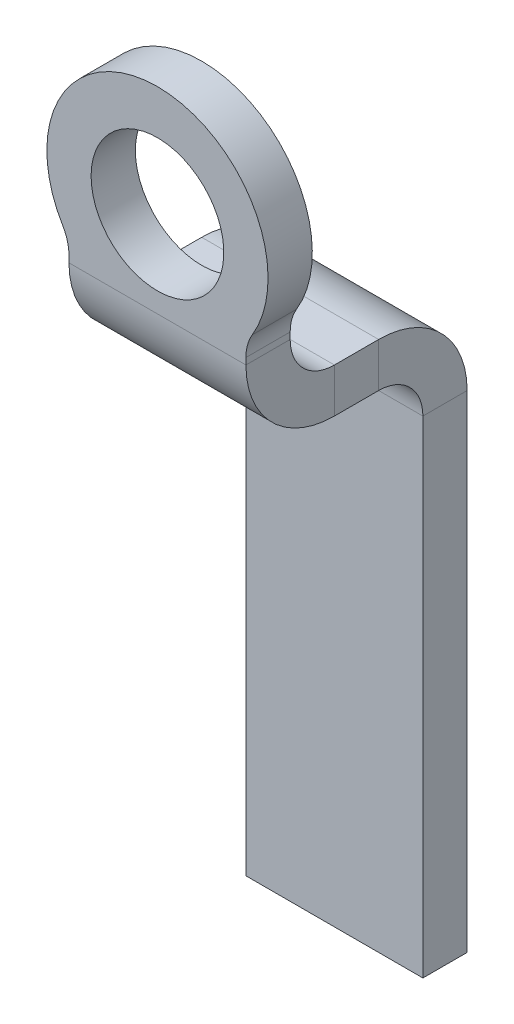
ISO-10303-21;
HEADER;
FILE_DESCRIPTION(('STEP AP214'),'2;1');
FILE_NAME('part.step','',(''),(''),'','','');
FILE_SCHEMA(('AUTOMOTIVE_DESIGN { 1 0 10303 214 1 1 1 1 }'));
ENDSEC;
DATA;
#1=APPLICATION_CONTEXT('core data for automotive mechanical design processes');
#2=APPLICATION_PROTOCOL_DEFINITION('international standard','automotive_design',2000,#1);
#3=PRODUCT_CONTEXT('',#1,'mechanical');
#4=PRODUCT('Part','Part','',(#3));
#5=PRODUCT_RELATED_PRODUCT_CATEGORY('part','',(#4));
#6=PRODUCT_DEFINITION_FORMATION('','',#4);
#7=PRODUCT_DEFINITION_CONTEXT('part definition',#1,'design');
#8=PRODUCT_DEFINITION('design','',#6,#7);
#9=PRODUCT_DEFINITION_SHAPE('','',#8);
#10=(LENGTH_UNIT() NAMED_UNIT(*) SI_UNIT(.MILLI.,.METRE.));
#11=(NAMED_UNIT(*) PLANE_ANGLE_UNIT() SI_UNIT($,.RADIAN.));
#12=(NAMED_UNIT(*) SI_UNIT($,.STERADIAN.) SOLID_ANGLE_UNIT());
#13=UNCERTAINTY_MEASURE_WITH_UNIT(LENGTH_MEASURE(1.E-05),#10,'distance_accuracy_value','');
#14=(GEOMETRIC_REPRESENTATION_CONTEXT(3) GLOBAL_UNCERTAINTY_ASSIGNED_CONTEXT((#13)) GLOBAL_UNIT_ASSIGNED_CONTEXT((#10,
#11,#12)) REPRESENTATION_CONTEXT('',''));
#15=CARTESIAN_POINT('',(0.,0.,0.));
#16=DIRECTION('',(0.,0.,1.));
#17=DIRECTION('',(1.,0.,0.));
#18=AXIS2_PLACEMENT_3D('',#15,#16,#17);
#19=CARTESIAN_POINT('',(0.,-3.,3.));
#20=DIRECTION('',(-1.,0.,0.));
#21=DIRECTION('',(0.,0.,1.));
#22=AXIS2_PLACEMENT_3D('',#19,#20,#21);
#23=PLANE('',#22);
#24=DIRECTION('',(0.,-1.,0.));
#25=VECTOR('',#24,1.);
#26=CARTESIAN_POINT('',(0.,-1.,3.00000000000002));
#27=LINE('',#26,#25);
#28=CARTESIAN_POINT('',(0.,1.,3.00000000000002));
#29=VERTEX_POINT('',#28);
#30=CARTESIAN_POINT('',(0.,-1.,3.00000000000002));
#31=VERTEX_POINT('',#30);
#32=EDGE_CURVE('E13',#29,#31,#27,.T.);
#33=ORIENTED_EDGE('',*,*,#32,.F.);
#34=CARTESIAN_POINT('',(0.,-3.,3.));
#35=DIRECTION('',(-1.,0.,0.));
#36=DIRECTION('',(0.,0.,1.));
#37=AXIS2_PLACEMENT_3D('',#34,#35,#36);
#38=CIRCLE('',#37,4.);
#39=CARTESIAN_POINT('',(0.,-3.00000000000003,-1.));
#40=VERTEX_POINT('',#39);
#41=EDGE_CURVE('E122',#40,#29,#38,.F.);
#42=ORIENTED_EDGE('',*,*,#41,.F.);
#43=DIRECTION('',(0.,0.,1.));
#44=VECTOR('',#43,1.);
#45=CARTESIAN_POINT('',(0.,-3.00000000000001,1.));
#46=LINE('',#45,#44);
#47=CARTESIAN_POINT('',(0.,-3.00000000000001,1.));
#48=VERTEX_POINT('',#47);
#49=EDGE_CURVE('E64',#40,#48,#46,.T.);
#50=ORIENTED_EDGE('',*,*,#49,.T.);
#51=CARTESIAN_POINT('',(0.,-3.,3.));
#52=DIRECTION('',(1.,0.,0.));
#53=DIRECTION('',(0.,0.,-1.));
#54=AXIS2_PLACEMENT_3D('',#51,#52,#53);
#55=CIRCLE('',#54,2.);
#56=EDGE_CURVE('E125',#48,#31,#55,.T.);
#57=ORIENTED_EDGE('',*,*,#56,.T.);
#58=EDGE_LOOP('',(#33,#42,#50,#57));
#59=FACE_BOUND('',#58,.T.);
#60=ADVANCED_FACE('F54',(#59),#23,.T.);
#61=CARTESIAN_POINT('',(0.,-25.,1.));
#62=DIRECTION('',(1.,0.,0.));
#63=DIRECTION('',(0.,1.,0.));
#64=AXIS2_PLACEMENT_3D('',#61,#62,#63);
#65=PLANE('',#64);
#66=ORIENTED_EDGE('',*,*,#49,.F.);
#67=DIRECTION('',(0.,1.,0.));
#68=VECTOR('',#67,1.);
#69=CARTESIAN_POINT('',(0.,-25.,-1.));
#70=LINE('',#69,#68);
#71=CARTESIAN_POINT('',(0.,-25.,-1.));
#72=VERTEX_POINT('',#71);
#73=EDGE_CURVE('E296',#72,#40,#70,.T.);
#74=ORIENTED_EDGE('',*,*,#73,.F.);
#75=DIRECTION('',(0.,0.,1.));
#76=VECTOR('',#75,1.);
#77=CARTESIAN_POINT('',(0.,-25.,1.));
#78=LINE('',#77,#76);
#79=CARTESIAN_POINT('',(0.,-25.,1.));
#80=VERTEX_POINT('',#79);
#81=EDGE_CURVE('E194',#72,#80,#78,.T.);
#82=ORIENTED_EDGE('',*,*,#81,.T.);
#83=DIRECTION('',(0.,1.,0.));
#84=VECTOR('',#83,1.);
#85=CARTESIAN_POINT('',(0.,-25.,1.));
#86=LINE('',#85,#84);
#87=EDGE_CURVE('E215',#80,#48,#86,.T.);
#88=ORIENTED_EDGE('',*,*,#87,.T.);
#89=EDGE_LOOP('',(#66,#74,#82,#88));
#90=FACE_BOUND('',#89,.T.);
#91=ADVANCED_FACE('F216',(#90),#65,.F.);
#92=CARTESIAN_POINT('',(8.,-25.,1.));
#93=DIRECTION('',(0.,1.,0.));
#94=DIRECTION('',(-1.,0.,0.));
#95=AXIS2_PLACEMENT_3D('',#92,#93,#94);
#96=PLANE('',#95);
#97=ORIENTED_EDGE('',*,*,#81,.F.);
#98=DIRECTION('',(1.,0.,0.));
#99=VECTOR('',#98,1.);
#100=CARTESIAN_POINT('',(8.,-25.,-1.));
#101=LINE('',#100,#99);
#102=CARTESIAN_POINT('',(8.,-25.,-1.));
#103=VERTEX_POINT('',#102);
#104=EDGE_CURVE('E294',#103,#72,#101,.F.);
#105=ORIENTED_EDGE('',*,*,#104,.F.);
#106=DIRECTION('',(0.,0.,1.));
#107=VECTOR('',#106,1.);
#108=CARTESIAN_POINT('',(8.,-25.,1.));
#109=LINE('',#108,#107);
#110=CARTESIAN_POINT('',(8.,-25.,1.));
#111=VERTEX_POINT('',#110);
#112=EDGE_CURVE('E191',#103,#111,#109,.T.);
#113=ORIENTED_EDGE('',*,*,#112,.T.);
#114=DIRECTION('',(-1.,0.,0.));
#115=VECTOR('',#114,1.);
#116=CARTESIAN_POINT('',(8.,-25.,1.));
#117=LINE('',#116,#115);
#118=EDGE_CURVE('E220',#111,#80,#117,.T.);
#119=ORIENTED_EDGE('',*,*,#118,.T.);
#120=EDGE_LOOP('',(#97,#105,#113,#119));
#121=FACE_BOUND('',#120,.T.);
#122=ADVANCED_FACE('F302',(#121),#96,.F.);
#123=CARTESIAN_POINT('',(8.,-25.,1.));
#124=DIRECTION('',(1.,0.,0.));
#125=DIRECTION('',(0.,1.,0.));
#126=AXIS2_PLACEMENT_3D('',#123,#124,#125);
#127=PLANE('',#126);
#128=ORIENTED_EDGE('',*,*,#112,.F.);
#129=DIRECTION('',(0.,1.,0.));
#130=VECTOR('',#129,1.);
#131=CARTESIAN_POINT('',(8.,-25.,-1.));
#132=LINE('',#131,#130);
#133=CARTESIAN_POINT('',(8.,-3.00000000000002,-1.));
#134=VERTEX_POINT('',#133);
#135=EDGE_CURVE('E159',#103,#134,#132,.T.);
#136=ORIENTED_EDGE('',*,*,#135,.T.);
#137=DIRECTION('',(0.,0.,1.));
#138=VECTOR('',#137,1.);
#139=CARTESIAN_POINT('',(8.,-3.00000000000001,1.));
#140=LINE('',#139,#138);
#141=CARTESIAN_POINT('',(8.,-3.00000000000001,1.));
#142=VERTEX_POINT('',#141);
#143=EDGE_CURVE('E188',#134,#142,#140,.T.);
#144=ORIENTED_EDGE('',*,*,#143,.T.);
#145=DIRECTION('',(0.,1.,0.));
#146=VECTOR('',#145,1.);
#147=CARTESIAN_POINT('',(8.,-25.,1.));
#148=LINE('',#147,#146);
#149=EDGE_CURVE('E226',#111,#142,#148,.T.);
#150=ORIENTED_EDGE('',*,*,#149,.F.);
#151=EDGE_LOOP('',(#128,#136,#144,#150));
#152=FACE_BOUND('',#151,.T.);
#153=ADVANCED_FACE('F307',(#152),#127,.T.);
#154=CARTESIAN_POINT('',(8.,-3.,3.));
#155=DIRECTION('',(-1.,0.,0.));
#156=DIRECTION('',(0.,0.,1.));
#157=AXIS2_PLACEMENT_3D('',#154,#155,#156);
#158=PLANE('',#157);
#159=ORIENTED_EDGE('',*,*,#143,.F.);
#160=CARTESIAN_POINT('',(8.,-3.,3.));
#161=DIRECTION('',(-1.,0.,0.));
#162=DIRECTION('',(0.,0.,1.));
#163=AXIS2_PLACEMENT_3D('',#160,#161,#162);
#164=CIRCLE('',#163,4.);
#165=CARTESIAN_POINT('',(8.,1.,3.00000000000002));
#166=VERTEX_POINT('',#165);
#167=EDGE_CURVE('E151',#134,#166,#164,.F.);
#168=ORIENTED_EDGE('',*,*,#167,.T.);
#169=DIRECTION('',(0.,-1.,0.));
#170=VECTOR('',#169,1.);
#171=CARTESIAN_POINT('',(8.,-1.,3.00000000000002));
#172=LINE('',#171,#170);
#173=CARTESIAN_POINT('',(8.,-1.,3.00000000000002));
#174=VERTEX_POINT('',#173);
#175=EDGE_CURVE('E185',#166,#174,#172,.T.);
#176=ORIENTED_EDGE('',*,*,#175,.T.);
#177=CARTESIAN_POINT('',(8.,-3.,3.));
#178=DIRECTION('',(1.,0.,0.));
#179=DIRECTION('',(0.,0.,-1.));
#180=AXIS2_PLACEMENT_3D('',#177,#178,#179);
#181=CIRCLE('',#180,2.);
#182=EDGE_CURVE('E211',#142,#174,#181,.T.);
#183=ORIENTED_EDGE('',*,*,#182,.F.);
#184=EDGE_LOOP('',(#159,#168,#176,#183));
#185=FACE_BOUND('',#184,.T.);
#186=ADVANCED_FACE('F310',(#185),#158,.F.);
#187=CARTESIAN_POINT('',(8.,-1.,3.00000000000002));
#188=DIRECTION('',(1.,0.,0.));
#189=DIRECTION('',(0.,0.,1.));
#190=AXIS2_PLACEMENT_3D('',#187,#188,#189);
#191=PLANE('',#190);
#192=ORIENTED_EDGE('',*,*,#175,.F.);
#193=DIRECTION('',(0.,0.,-1.));
#194=VECTOR('',#193,1.);
#195=CARTESIAN_POINT('',(8.,1.,3.00000000000002));
#196=LINE('',#195,#194);
#197=CARTESIAN_POINT('',(8.,1.,5.));
#198=VERTEX_POINT('',#197);
#199=EDGE_CURVE('E141',#166,#198,#196,.F.);
#200=ORIENTED_EDGE('',*,*,#199,.T.);
#201=DIRECTION('',(0.,-1.,0.));
#202=VECTOR('',#201,1.);
#203=CARTESIAN_POINT('',(8.,-1.,5.));
#204=LINE('',#203,#202);
#205=CARTESIAN_POINT('',(8.,-1.,5.));
#206=VERTEX_POINT('',#205);
#207=EDGE_CURVE('E182',#198,#206,#204,.T.);
#208=ORIENTED_EDGE('',*,*,#207,.T.);
#209=DIRECTION('',(0.,0.,1.));
#210=VECTOR('',#209,1.);
#211=CARTESIAN_POINT('',(8.,-1.,3.00000000000002));
#212=LINE('',#211,#210);
#213=EDGE_CURVE('E235',#174,#206,#212,.T.);
#214=ORIENTED_EDGE('',*,*,#213,.F.);
#215=EDGE_LOOP('',(#192,#200,#208,#214));
#216=FACE_BOUND('',#215,.T.);
#217=ADVANCED_FACE('F316',(#216),#191,.T.);
#218=CARTESIAN_POINT('',(8.,3.,5.));
#219=DIRECTION('',(-1.,0.,0.));
#220=DIRECTION('',(0.,0.,1.));
#221=AXIS2_PLACEMENT_3D('',#218,#219,#220);
#222=PLANE('',#221);
#223=ORIENTED_EDGE('',*,*,#207,.F.);
#224=CARTESIAN_POINT('',(8.,3.,5.));
#225=DIRECTION('',(-1.,0.,0.));
#226=DIRECTION('',(0.,0.,1.));
#227=AXIS2_PLACEMENT_3D('',#224,#225,#226);
#228=CIRCLE('',#227,2.);
#229=CARTESIAN_POINT('',(8.,3.,7.));
#230=VERTEX_POINT('',#229);
#231=EDGE_CURVE('E221',#198,#230,#228,.T.);
#232=ORIENTED_EDGE('',*,*,#231,.T.);
#233=DIRECTION('',(0.,0.,1.));
#234=VECTOR('',#233,1.);
#235=CARTESIAN_POINT('',(8.,3.,9.));
#236=LINE('',#235,#234);
#237=CARTESIAN_POINT('',(8.,3.,9.));
#238=VERTEX_POINT('',#237);
#239=EDGE_CURVE('E72',#230,#238,#236,.T.);
#240=ORIENTED_EDGE('',*,*,#239,.T.);
#241=CARTESIAN_POINT('',(8.,3.,5.));
#242=DIRECTION('',(1.,0.,0.));
#243=DIRECTION('',(0.,0.,-1.));
#244=AXIS2_PLACEMENT_3D('',#241,#242,#243);
#245=CIRCLE('',#244,4.);
#246=EDGE_CURVE('E265',#206,#238,#245,.F.);
#247=ORIENTED_EDGE('',*,*,#246,.F.);
#248=EDGE_LOOP('',(#223,#232,#240,#247));
#249=FACE_BOUND('',#248,.T.);
#250=ADVANCED_FACE('F353',(#249),#222,.F.);
#251=CARTESIAN_POINT('',(8.,3.,9.));
#252=DIRECTION('',(1.,0.,0.));
#253=DIRECTION('',(0.,1.,0.));
#254=AXIS2_PLACEMENT_3D('',#251,#252,#253);
#255=PLANE('',#254);
#256=ORIENTED_EDGE('',*,*,#239,.F.);
#257=DIRECTION('',(0.,1.,0.));
#258=VECTOR('',#257,1.);
#259=CARTESIAN_POINT('',(8.,3.,7.));
#260=LINE('',#259,#258);
#261=CARTESIAN_POINT('',(8.,3.294448724536,7.));
#262=VERTEX_POINT('',#261);
#263=EDGE_CURVE('E166',#230,#262,#260,.T.);
#264=ORIENTED_EDGE('',*,*,#263,.T.);
#265=DIRECTION('',(0.,0.,1.));
#266=VECTOR('',#265,1.);
#267=CARTESIAN_POINT('',(8.,3.294448724536,9.));
#268=LINE('',#267,#266);
#269=CARTESIAN_POINT('',(8.,3.294448724536,9.));
#270=VERTEX_POINT('',#269);
#271=EDGE_CURVE('E178',#262,#270,#268,.T.);
#272=ORIENTED_EDGE('',*,*,#271,.T.);
#273=DIRECTION('',(0.,1.,0.));
#274=VECTOR('',#273,1.);
#275=CARTESIAN_POINT('',(8.,3.,9.));
#276=LINE('',#275,#274);
#277=EDGE_CURVE('E244',#238,#270,#276,.T.);
#278=ORIENTED_EDGE('',*,*,#277,.F.);
#279=EDGE_LOOP('',(#256,#264,#272,#278));
#280=FACE_BOUND('',#279,.T.);
#281=ADVANCED_FACE('F363',(#280),#255,.T.);
#282=CARTESIAN_POINT('',(10.,3.294448724536,9.));
#283=DIRECTION('',(0.,0.,1.));
#284=DIRECTION('',(1.,0.,0.));
#285=AXIS2_PLACEMENT_3D('',#282,#283,#284);
#286=CYLINDRICAL_SURFACE('',#285,2.);
#287=ORIENTED_EDGE('',*,*,#271,.F.);
#288=CARTESIAN_POINT('',(10.,3.294448724536,7.));
#289=DIRECTION('',(0.,0.,1.));
#290=DIRECTION('',(1.,0.,0.));
#291=AXIS2_PLACEMENT_3D('',#288,#289,#290);
#292=CIRCLE('',#291,2.);
#293=CARTESIAN_POINT('',(8.28571428571429,4.32460623181143,7.));
#294=VERTEX_POINT('',#293);
#295=EDGE_CURVE('E284',#262,#294,#292,.F.);
#296=ORIENTED_EDGE('',*,*,#295,.T.);
#297=DIRECTION('',(0.,0.,1.));
#298=VECTOR('',#297,1.);
#299=CARTESIAN_POINT('',(8.28571428571429,4.32460623181143,9.));
#300=LINE('',#299,#298);
#301=CARTESIAN_POINT('',(8.28571428571429,4.32460623181143,9.));
#302=VERTEX_POINT('',#301);
#303=EDGE_CURVE('E175',#294,#302,#300,.T.);
#304=ORIENTED_EDGE('',*,*,#303,.T.);
#305=CARTESIAN_POINT('',(10.,3.294448724536,9.));
#306=DIRECTION('',(0.,0.,1.));
#307=DIRECTION('',(1.,0.,0.));
#308=AXIS2_PLACEMENT_3D('',#305,#306,#307);
#309=CIRCLE('',#308,2.);
#310=EDGE_CURVE('E247',#270,#302,#309,.F.);
#311=ORIENTED_EDGE('',*,*,#310,.F.);
#312=EDGE_LOOP('',(#287,#296,#304,#311));
#313=FACE_BOUND('',#312,.T.);
#314=ADVANCED_FACE('F359',(#313),#286,.F.);
#315=CARTESIAN_POINT('',(4.,6.9,9.));
#316=DIRECTION('',(0.,0.,-1.));
#317=DIRECTION('',(-1.,0.,0.));
#318=AXIS2_PLACEMENT_3D('',#315,#316,#317);
#319=CYLINDRICAL_SURFACE('',#318,5.);
#320=ORIENTED_EDGE('',*,*,#303,.F.);
#321=CARTESIAN_POINT('',(4.,6.9,7.));
#322=DIRECTION('',(0.,0.,-1.));
#323=DIRECTION('',(-1.,0.,0.));
#324=AXIS2_PLACEMENT_3D('',#321,#322,#323);
#325=CIRCLE('',#324,5.);
#326=CARTESIAN_POINT('',(-0.285714285714287,4.32460623181143,7.));
#327=VERTEX_POINT('',#326);
#328=EDGE_CURVE('E281',#327,#294,#325,.T.);
#329=ORIENTED_EDGE('',*,*,#328,.F.);
#330=DIRECTION('',(0.,0.,1.));
#331=VECTOR('',#330,1.);
#332=CARTESIAN_POINT('',(-0.285714285714287,4.32460623181143,9.));
#333=LINE('',#332,#331);
#334=CARTESIAN_POINT('',(-0.285714285714287,4.32460623181143,9.));
#335=VERTEX_POINT('',#334);
#336=EDGE_CURVE('E172',#327,#335,#333,.T.);
#337=ORIENTED_EDGE('',*,*,#336,.T.);
#338=CARTESIAN_POINT('',(4.,6.9,9.));
#339=DIRECTION('',(0.,0.,-1.));
#340=DIRECTION('',(-1.,0.,0.));
#341=AXIS2_PLACEMENT_3D('',#338,#339,#340);
#342=CIRCLE('',#341,5.);
#343=EDGE_CURVE('E250',#335,#302,#342,.T.);
#344=ORIENTED_EDGE('',*,*,#343,.T.);
#345=EDGE_LOOP('',(#320,#329,#337,#344));
#346=FACE_BOUND('',#345,.T.);
#347=ADVANCED_FACE('F362',(#346),#319,.T.);
#348=CARTESIAN_POINT('',(-2.,3.294448724536,9.));
#349=DIRECTION('',(0.,0.,1.));
#350=DIRECTION('',(1.,0.,0.));
#351=AXIS2_PLACEMENT_3D('',#348,#349,#350);
#352=CYLINDRICAL_SURFACE('',#351,2.);
#353=ORIENTED_EDGE('',*,*,#336,.F.);
#354=CARTESIAN_POINT('',(-2.,3.294448724536,7.));
#355=DIRECTION('',(0.,0.,1.));
#356=DIRECTION('',(1.,0.,0.));
#357=AXIS2_PLACEMENT_3D('',#354,#355,#356);
#358=CIRCLE('',#357,2.);
#359=CARTESIAN_POINT('',(0.,3.294448724536,7.));
#360=VERTEX_POINT('',#359);
#361=EDGE_CURVE('E278',#327,#360,#358,.F.);
#362=ORIENTED_EDGE('',*,*,#361,.T.);
#363=DIRECTION('',(0.,0.,1.));
#364=VECTOR('',#363,1.);
#365=CARTESIAN_POINT('',(0.,3.294448724536,9.));
#366=LINE('',#365,#364);
#367=CARTESIAN_POINT('',(0.,3.294448724536,9.));
#368=VERTEX_POINT('',#367);
#369=EDGE_CURVE('E169',#360,#368,#366,.T.);
#370=ORIENTED_EDGE('',*,*,#369,.T.);
#371=CARTESIAN_POINT('',(-2.,3.294448724536,9.));
#372=DIRECTION('',(0.,0.,1.));
#373=DIRECTION('',(1.,0.,0.));
#374=AXIS2_PLACEMENT_3D('',#371,#372,#373);
#375=CIRCLE('',#374,2.);
#376=EDGE_CURVE('E253',#335,#368,#375,.F.);
#377=ORIENTED_EDGE('',*,*,#376,.F.);
#378=EDGE_LOOP('',(#353,#362,#370,#377));
#379=FACE_BOUND('',#378,.T.);
#380=ADVANCED_FACE('F334',(#379),#352,.F.);
#381=CARTESIAN_POINT('',(0.,3.,9.));
#382=DIRECTION('',(1.,0.,0.));
#383=DIRECTION('',(0.,1.,0.));
#384=AXIS2_PLACEMENT_3D('',#381,#382,#383);
#385=PLANE('',#384);
#386=ORIENTED_EDGE('',*,*,#369,.F.);
#387=DIRECTION('',(0.,1.,0.));
#388=VECTOR('',#387,1.);
#389=CARTESIAN_POINT('',(0.,3.,7.));
#390=LINE('',#389,#388);
#391=CARTESIAN_POINT('',(0.,3.,7.));
#392=VERTEX_POINT('',#391);
#393=EDGE_CURVE('E272',#392,#360,#390,.T.);
#394=ORIENTED_EDGE('',*,*,#393,.F.);
#395=DIRECTION('',(0.,0.,1.));
#396=VECTOR('',#395,1.);
#397=CARTESIAN_POINT('',(0.,3.,9.));
#398=LINE('',#397,#396);
#399=CARTESIAN_POINT('',(0.,3.,9.));
#400=VERTEX_POINT('',#399);
#401=EDGE_CURVE('E167',#392,#400,#398,.T.);
#402=ORIENTED_EDGE('',*,*,#401,.T.);
#403=DIRECTION('',(0.,1.,0.));
#404=VECTOR('',#403,1.);
#405=CARTESIAN_POINT('',(0.,3.,9.));
#406=LINE('',#405,#404);
#407=EDGE_CURVE('E256',#400,#368,#406,.T.);
#408=ORIENTED_EDGE('',*,*,#407,.T.);
#409=EDGE_LOOP('',(#386,#394,#402,#408));
#410=FACE_BOUND('',#409,.T.);
#411=ADVANCED_FACE('F343',(#410),#385,.F.);
#412=CARTESIAN_POINT('',(0.,3.,5.));
#413=DIRECTION('',(-1.,0.,0.));
#414=DIRECTION('',(0.,0.,1.));
#415=AXIS2_PLACEMENT_3D('',#412,#413,#414);
#416=PLANE('',#415);
#417=ORIENTED_EDGE('',*,*,#401,.F.);
#418=CARTESIAN_POINT('',(0.,3.,5.));
#419=DIRECTION('',(-1.,0.,0.));
#420=DIRECTION('',(0.,0.,1.));
#421=AXIS2_PLACEMENT_3D('',#418,#419,#420);
#422=CIRCLE('',#421,2.);
#423=CARTESIAN_POINT('',(0.,1.,5.));
#424=VERTEX_POINT('',#423);
#425=EDGE_CURVE('E271',#424,#392,#422,.T.);
#426=ORIENTED_EDGE('',*,*,#425,.F.);
#427=DIRECTION('',(0.,-1.,0.));
#428=VECTOR('',#427,1.);
#429=CARTESIAN_POINT('',(0.,-1.,5.));
#430=LINE('',#429,#428);
#431=CARTESIAN_POINT('',(0.,-1.,5.));
#432=VERTEX_POINT('',#431);
#433=EDGE_CURVE('E58',#424,#432,#430,.T.);
#434=ORIENTED_EDGE('',*,*,#433,.T.);
#435=CARTESIAN_POINT('',(0.,3.,5.));
#436=DIRECTION('',(1.,0.,0.));
#437=DIRECTION('',(0.,0.,-1.));
#438=AXIS2_PLACEMENT_3D('',#435,#436,#437);
#439=CIRCLE('',#438,4.);
#440=EDGE_CURVE('E262',#432,#400,#439,.F.);
#441=ORIENTED_EDGE('',*,*,#440,.T.);
#442=EDGE_LOOP('',(#417,#426,#434,#441));
#443=FACE_BOUND('',#442,.T.);
#444=ADVANCED_FACE('F344',(#443),#416,.T.);
#445=CARTESIAN_POINT('',(4.,6.9,9.));
#446=DIRECTION('',(0.,0.,-1.));
#447=DIRECTION('',(-1.,0.,0.));
#448=AXIS2_PLACEMENT_3D('',#445,#446,#447);
#449=CYLINDRICAL_SURFACE('',#448,3.);
#450=CARTESIAN_POINT('',(4.,6.9,9.));
#451=DIRECTION('',(0.,0.,-1.));
#452=DIRECTION('',(-1.,0.,0.));
#453=AXIS2_PLACEMENT_3D('',#450,#451,#452);
#454=CIRCLE('',#453,3.);
#455=CARTESIAN_POINT('',(1.,6.9,9.));
#456=VERTEX_POINT('',#455);
#457=EDGE_CURVE('E241',#456,#456,#454,.T.);
#458=ORIENTED_EDGE('',*,*,#457,.F.);
#459=EDGE_LOOP('',(#458));
#460=FACE_BOUND('',#459,.T.);
#461=CARTESIAN_POINT('',(4.,6.9,7.));
#462=DIRECTION('',(0.,0.,-1.));
#463=DIRECTION('',(-1.,0.,0.));
#464=AXIS2_PLACEMENT_3D('',#461,#462,#463);
#465=CIRCLE('',#464,3.);
#466=CARTESIAN_POINT('',(1.,6.9,7.));
#467=VERTEX_POINT('',#466);
#468=EDGE_CURVE('E163',#467,#467,#465,.T.);
#469=ORIENTED_EDGE('',*,*,#468,.T.);
#470=EDGE_LOOP('',(#469));
#471=FACE_BOUND('',#470,.T.);
#472=ADVANCED_FACE('F56',(#460,#471),#449,.F.);
#473=CARTESIAN_POINT('',(0.,-1.,3.00000000000002));
#474=DIRECTION('',(1.,0.,0.));
#475=DIRECTION('',(0.,0.,1.));
#476=AXIS2_PLACEMENT_3D('',#473,#474,#475);
#477=PLANE('',#476);
#478=DIRECTION('',(0.,0.,-1.));
#479=VECTOR('',#478,1.);
#480=CARTESIAN_POINT('',(0.,1.,3.00000000000002));
#481=LINE('',#480,#479);
#482=EDGE_CURVE('E138',#29,#424,#481,.F.);
#483=ORIENTED_EDGE('',*,*,#482,.F.);
#484=ORIENTED_EDGE('',*,*,#32,.T.);
#485=DIRECTION('',(0.,0.,1.));
#486=VECTOR('',#485,1.);
#487=CARTESIAN_POINT('',(0.,-1.,3.00000000000002));
#488=LINE('',#487,#486);
#489=EDGE_CURVE('E228',#31,#432,#488,.T.);
#490=ORIENTED_EDGE('',*,*,#489,.T.);
#491=ORIENTED_EDGE('',*,*,#433,.F.);
#492=EDGE_LOOP('',(#483,#484,#490,#491));
#493=FACE_BOUND('',#492,.T.);
#494=ADVANCED_FACE('F155',(#493),#477,.F.);
#495=CARTESIAN_POINT('',(8.,3.,5.));
#496=DIRECTION('',(-1.,0.,0.));
#497=DIRECTION('',(0.,0.,1.));
#498=AXIS2_PLACEMENT_3D('',#495,#496,#497);
#499=CYLINDRICAL_SURFACE('',#498,4.);
#500=ORIENTED_EDGE('',*,*,#440,.F.);
#501=DIRECTION('',(-1.,0.,0.));
#502=VECTOR('',#501,1.);
#503=CARTESIAN_POINT('',(8.,-1.,5.));
#504=LINE('',#503,#502);
#505=EDGE_CURVE('E212',#206,#432,#504,.T.);
#506=ORIENTED_EDGE('',*,*,#505,.F.);
#507=ORIENTED_EDGE('',*,*,#246,.T.);
#508=DIRECTION('',(-1.,0.,0.));
#509=VECTOR('',#508,1.);
#510=CARTESIAN_POINT('',(8.,3.,9.));
#511=LINE('',#510,#509);
#512=EDGE_CURVE('E259',#238,#400,#511,.T.);
#513=ORIENTED_EDGE('',*,*,#512,.T.);
#514=EDGE_LOOP('',(#500,#506,#507,#513));
#515=FACE_BOUND('',#514,.T.);
#516=ADVANCED_FACE('F355',(#515),#499,.T.);
#517=CARTESIAN_POINT('',(8.,3.,9.));
#518=DIRECTION('',(0.,0.,1.));
#519=DIRECTION('',(1.,0.,0.));
#520=AXIS2_PLACEMENT_3D('',#517,#518,#519);
#521=PLANE('',#520);
#522=ORIENTED_EDGE('',*,*,#457,.T.);
#523=EDGE_LOOP('',(#522));
#524=FACE_BOUND('',#523,.T.);
#525=ORIENTED_EDGE('',*,*,#277,.T.);
#526=ORIENTED_EDGE('',*,*,#310,.T.);
#527=ORIENTED_EDGE('',*,*,#343,.F.);
#528=ORIENTED_EDGE('',*,*,#376,.T.);
#529=ORIENTED_EDGE('',*,*,#407,.F.);
#530=ORIENTED_EDGE('',*,*,#512,.F.);
#531=EDGE_LOOP('',(#525,#526,#527,#528,#529,#530));
#532=FACE_BOUND('',#531,.T.);
#533=ADVANCED_FACE('F341',(#524,#532),#521,.T.);
#534=CARTESIAN_POINT('',(8.,-3.,3.));
#535=DIRECTION('',(-1.,0.,0.));
#536=DIRECTION('',(0.,0.,1.));
#537=AXIS2_PLACEMENT_3D('',#534,#535,#536);
#538=CYLINDRICAL_SURFACE('',#537,2.);
#539=ORIENTED_EDGE('',*,*,#56,.F.);
#540=DIRECTION('',(-1.,0.,0.));
#541=VECTOR('',#540,1.);
#542=CARTESIAN_POINT('',(8.,-3.00000000000001,1.));
#543=LINE('',#542,#541);
#544=EDGE_CURVE('E208',#142,#48,#543,.T.);
#545=ORIENTED_EDGE('',*,*,#544,.F.);
#546=ORIENTED_EDGE('',*,*,#182,.T.);
#547=DIRECTION('',(-1.,0.,0.));
#548=VECTOR('',#547,1.);
#549=CARTESIAN_POINT('',(8.,-1.,3.00000000000002));
#550=LINE('',#549,#548);
#551=EDGE_CURVE('E210',#174,#31,#550,.T.);
#552=ORIENTED_EDGE('',*,*,#551,.T.);
#553=EDGE_LOOP('',(#539,#545,#546,#552));
#554=FACE_BOUND('',#553,.T.);
#555=ADVANCED_FACE('F205',(#554),#538,.F.);
#556=CARTESIAN_POINT('',(8.,-1.,3.00000000000002));
#557=DIRECTION('',(0.,-1.,0.));
#558=DIRECTION('',(0.,0.,-1.));
#559=AXIS2_PLACEMENT_3D('',#556,#557,#558);
#560=PLANE('',#559);
#561=ORIENTED_EDGE('',*,*,#489,.F.);
#562=ORIENTED_EDGE('',*,*,#551,.F.);
#563=ORIENTED_EDGE('',*,*,#213,.T.);
#564=ORIENTED_EDGE('',*,*,#505,.T.);
#565=EDGE_LOOP('',(#561,#562,#563,#564));
#566=FACE_BOUND('',#565,.T.);
#567=ADVANCED_FACE('F318',(#566),#560,.T.);
#568=CARTESIAN_POINT('',(8.,-25.,1.));
#569=DIRECTION('',(0.,0.,1.));
#570=DIRECTION('',(1.,0.,0.));
#571=AXIS2_PLACEMENT_3D('',#568,#569,#570);
#572=PLANE('',#571);
#573=ORIENTED_EDGE('',*,*,#87,.F.);
#574=ORIENTED_EDGE('',*,*,#118,.F.);
#575=ORIENTED_EDGE('',*,*,#149,.T.);
#576=ORIENTED_EDGE('',*,*,#544,.T.);
#577=EDGE_LOOP('',(#573,#574,#575,#576));
#578=FACE_BOUND('',#577,.T.);
#579=ADVANCED_FACE('F224',(#578),#572,.T.);
#580=CARTESIAN_POINT('',(8.,3.,5.));
#581=DIRECTION('',(-1.,0.,0.));
#582=DIRECTION('',(0.,0.,1.));
#583=AXIS2_PLACEMENT_3D('',#580,#581,#582);
#584=CYLINDRICAL_SURFACE('',#583,2.);
#585=ORIENTED_EDGE('',*,*,#425,.T.);
#586=DIRECTION('',(-1.,0.,0.));
#587=VECTOR('',#586,1.);
#588=CARTESIAN_POINT('',(8.,3.,7.));
#589=LINE('',#588,#587);
#590=EDGE_CURVE('E269',#230,#392,#589,.T.);
#591=ORIENTED_EDGE('',*,*,#590,.F.);
#592=ORIENTED_EDGE('',*,*,#231,.F.);
#593=DIRECTION('',(1.,0.,0.));
#594=VECTOR('',#593,1.);
#595=CARTESIAN_POINT('',(8.,1.,5.));
#596=LINE('',#595,#594);
#597=EDGE_CURVE('E152',#198,#424,#596,.F.);
#598=ORIENTED_EDGE('',*,*,#597,.T.);
#599=EDGE_LOOP('',(#585,#591,#592,#598));
#600=FACE_BOUND('',#599,.T.);
#601=ADVANCED_FACE('F352',(#600),#584,.F.);
#602=CARTESIAN_POINT('',(8.,3.,7.));
#603=DIRECTION('',(0.,0.,1.));
#604=DIRECTION('',(1.,0.,0.));
#605=AXIS2_PLACEMENT_3D('',#602,#603,#604);
#606=PLANE('',#605);
#607=ORIENTED_EDGE('',*,*,#468,.F.);
#608=EDGE_LOOP('',(#607));
#609=FACE_BOUND('',#608,.T.);
#610=ORIENTED_EDGE('',*,*,#263,.F.);
#611=ORIENTED_EDGE('',*,*,#590,.T.);
#612=ORIENTED_EDGE('',*,*,#393,.T.);
#613=ORIENTED_EDGE('',*,*,#361,.F.);
#614=ORIENTED_EDGE('',*,*,#328,.T.);
#615=ORIENTED_EDGE('',*,*,#295,.F.);
#616=EDGE_LOOP('',(#610,#611,#612,#613,#614,#615));
#617=FACE_BOUND('',#616,.T.);
#618=ADVANCED_FACE('F348',(#609,#617),#606,.F.);
#619=CARTESIAN_POINT('',(8.,-3.,3.));
#620=DIRECTION('',(-1.,0.,0.));
#621=DIRECTION('',(0.,0.,1.));
#622=AXIS2_PLACEMENT_3D('',#619,#620,#621);
#623=CYLINDRICAL_SURFACE('',#622,4.);
#624=ORIENTED_EDGE('',*,*,#41,.T.);
#625=DIRECTION('',(-1.,0.,0.));
#626=VECTOR('',#625,1.);
#627=CARTESIAN_POINT('',(8.,1.,3.00000000000004));
#628=LINE('',#627,#626);
#629=EDGE_CURVE('E135',#166,#29,#628,.T.);
#630=ORIENTED_EDGE('',*,*,#629,.F.);
#631=ORIENTED_EDGE('',*,*,#167,.F.);
#632=DIRECTION('',(1.,0.,0.));
#633=VECTOR('',#632,1.);
#634=CARTESIAN_POINT('',(8.,-3.00000000000002,-1.));
#635=LINE('',#634,#633);
#636=EDGE_CURVE('E149',#134,#40,#635,.F.);
#637=ORIENTED_EDGE('',*,*,#636,.T.);
#638=EDGE_LOOP('',(#624,#630,#631,#637));
#639=FACE_BOUND('',#638,.T.);
#640=ADVANCED_FACE('F147',(#639),#623,.T.);
#641=CARTESIAN_POINT('',(8.,1.,3.00000000000002));
#642=DIRECTION('',(0.,-1.,0.));
#643=DIRECTION('',(0.,0.,-1.));
#644=AXIS2_PLACEMENT_3D('',#641,#642,#643);
#645=PLANE('',#644);
#646=ORIENTED_EDGE('',*,*,#482,.T.);
#647=ORIENTED_EDGE('',*,*,#597,.F.);
#648=ORIENTED_EDGE('',*,*,#199,.F.);
#649=ORIENTED_EDGE('',*,*,#629,.T.);
#650=EDGE_LOOP('',(#646,#647,#648,#649));
#651=FACE_BOUND('',#650,.T.);
#652=ADVANCED_FACE('F136',(#651),#645,.F.);
#653=CARTESIAN_POINT('',(8.,-25.,-1.));
#654=DIRECTION('',(0.,0.,1.));
#655=DIRECTION('',(1.,0.,0.));
#656=AXIS2_PLACEMENT_3D('',#653,#654,#655);
#657=PLANE('',#656);
#658=ORIENTED_EDGE('',*,*,#73,.T.);
#659=ORIENTED_EDGE('',*,*,#636,.F.);
#660=ORIENTED_EDGE('',*,*,#135,.F.);
#661=ORIENTED_EDGE('',*,*,#104,.T.);
#662=EDGE_LOOP('',(#658,#659,#660,#661));
#663=FACE_BOUND('',#662,.T.);
#664=ADVANCED_FACE('F298',(#663),#657,.F.);
#665=CLOSED_SHELL('',(#60,#91,#122,#153,#186,#217,#250,#281,#314,#347,#380,#411,#444,#472,#494,
#516,#533,#555,#567,#579,#601,#618,#640,#652,#664));
#666=MANIFOLD_SOLID_BREP('B2',#665);
#667=ADVANCED_BREP_SHAPE_REPRESENTATION('',(#18,#666),#14);
#668=SHAPE_DEFINITION_REPRESENTATION(#9,#667);
ENDSEC;
END-ISO-10303-21;
